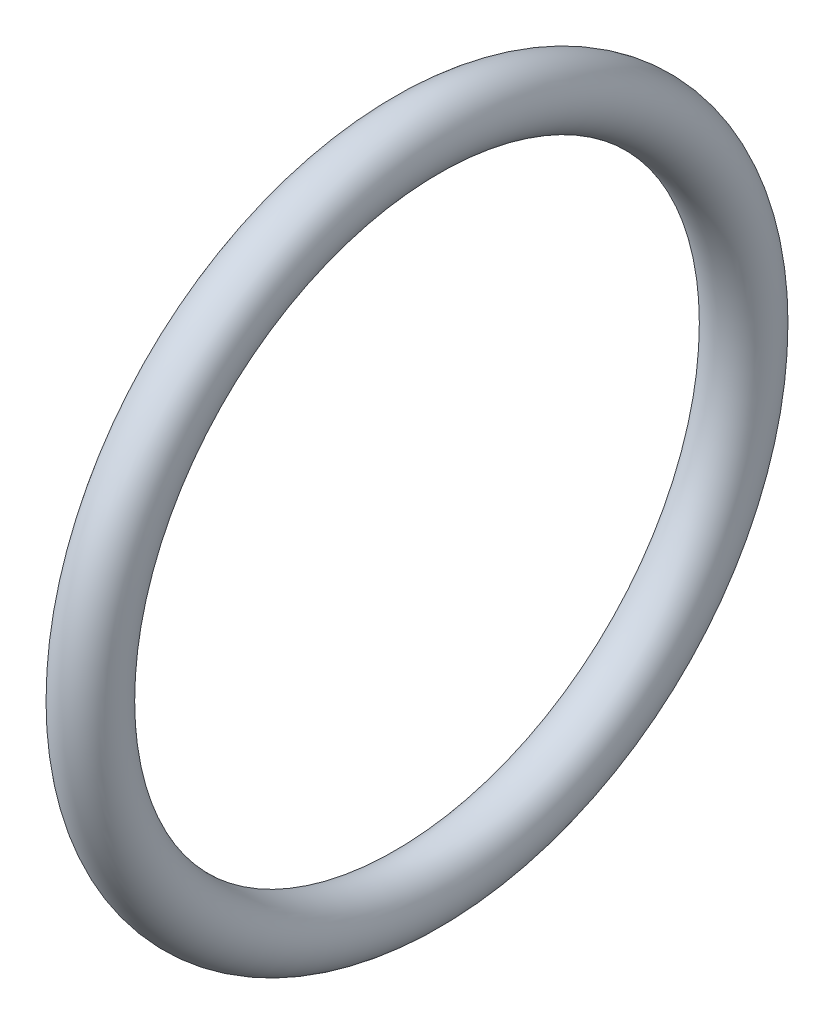
ISO-10303-21;
HEADER;
FILE_DESCRIPTION(('STEP AP214'),'2;1');
FILE_NAME('part.step','',(''),(''),'','','');
FILE_SCHEMA(('AUTOMOTIVE_DESIGN { 1 0 10303 214 1 1 1 1 }'));
ENDSEC;
DATA;
#1=APPLICATION_CONTEXT('core data for automotive mechanical design processes');
#2=APPLICATION_PROTOCOL_DEFINITION('international standard','automotive_design',2000,#1);
#3=PRODUCT_CONTEXT('',#1,'mechanical');
#4=PRODUCT('Part','Part','',(#3));
#5=PRODUCT_RELATED_PRODUCT_CATEGORY('part','',(#4));
#6=PRODUCT_DEFINITION_FORMATION('','',#4);
#7=PRODUCT_DEFINITION_CONTEXT('part definition',#1,'design');
#8=PRODUCT_DEFINITION('design','',#6,#7);
#9=PRODUCT_DEFINITION_SHAPE('','',#8);
#10=(LENGTH_UNIT() NAMED_UNIT(*) SI_UNIT(.MILLI.,.METRE.));
#11=(NAMED_UNIT(*) PLANE_ANGLE_UNIT() SI_UNIT($,.RADIAN.));
#12=(NAMED_UNIT(*) SI_UNIT($,.STERADIAN.) SOLID_ANGLE_UNIT());
#13=UNCERTAINTY_MEASURE_WITH_UNIT(LENGTH_MEASURE(1.E-05),#10,'distance_accuracy_value','');
#14=(GEOMETRIC_REPRESENTATION_CONTEXT(3) GLOBAL_UNCERTAINTY_ASSIGNED_CONTEXT((#13)) GLOBAL_UNIT_ASSIGNED_CONTEXT((#10,
#11,#12)) REPRESENTATION_CONTEXT('',''));
#15=CARTESIAN_POINT('',(0.,0.,0.));
#16=DIRECTION('',(0.,0.,1.));
#17=DIRECTION('',(1.,0.,0.));
#18=AXIS2_PLACEMENT_3D('',#15,#16,#17);
#19=CARTESIAN_POINT('',(7.51666049839539,0.,0.));
#20=DIRECTION('',(-1.,0.,0.));
#21=DIRECTION('',(0.,0.,1.));
#22=AXIS2_PLACEMENT_3D('',#19,#20,#21);
#23=TOROIDAL_SURFACE('',#22,26.0414518843274,2.5);
#24=CARTESIAN_POINT('',(7.51666049839539,0.,28.5414518843274));
#25=VERTEX_POINT('',#24);
#26=VERTEX_LOOP('',#25);
#27=FACE_BOUND('',#26,.T.);
#28=ADVANCED_FACE('F29',(#27),#23,.T.);
#29=CLOSED_SHELL('',(#28));
#30=MANIFOLD_SOLID_BREP('B2',#29);
#31=ADVANCED_BREP_SHAPE_REPRESENTATION('',(#18,#30),#14);
#32=SHAPE_DEFINITION_REPRESENTATION(#9,#31);
ENDSEC;
END-ISO-10303-21;
